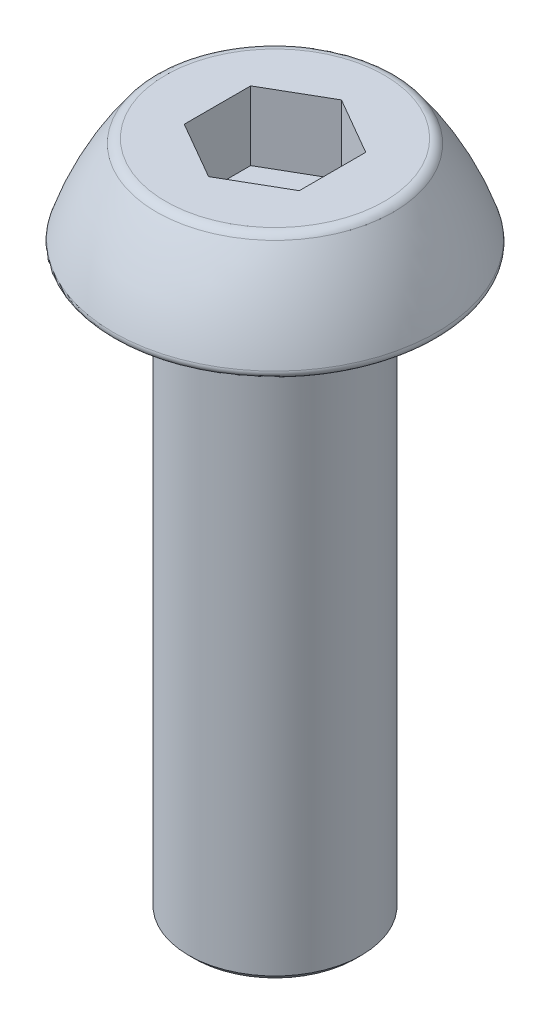
ISO-10303-21;
HEADER;
FILE_DESCRIPTION(('STEP AP214'),'2;1');
FILE_NAME('part.step','',(''),(''),'','','');
FILE_SCHEMA(('AUTOMOTIVE_DESIGN { 1 0 10303 214 1 1 1 1 }'));
ENDSEC;
DATA;
#1=APPLICATION_CONTEXT('core data for automotive mechanical design processes');
#2=APPLICATION_PROTOCOL_DEFINITION('international standard','automotive_design',2000,#1);
#3=PRODUCT_CONTEXT('',#1,'mechanical');
#4=PRODUCT('Part','Part','',(#3));
#5=PRODUCT_RELATED_PRODUCT_CATEGORY('part','',(#4));
#6=PRODUCT_DEFINITION_FORMATION('','',#4);
#7=PRODUCT_DEFINITION_CONTEXT('part definition',#1,'design');
#8=PRODUCT_DEFINITION('design','',#6,#7);
#9=PRODUCT_DEFINITION_SHAPE('','',#8);
#10=(LENGTH_UNIT() NAMED_UNIT(*) SI_UNIT(.MILLI.,.METRE.));
#11=(NAMED_UNIT(*) PLANE_ANGLE_UNIT() SI_UNIT($,.RADIAN.));
#12=(NAMED_UNIT(*) SI_UNIT($,.STERADIAN.) SOLID_ANGLE_UNIT());
#13=UNCERTAINTY_MEASURE_WITH_UNIT(LENGTH_MEASURE(1.E-05),#10,'distance_accuracy_value','');
#14=(GEOMETRIC_REPRESENTATION_CONTEXT(3) GLOBAL_UNCERTAINTY_ASSIGNED_CONTEXT((#13)) GLOBAL_UNIT_ASSIGNED_CONTEXT((#10,
#11,#12)) REPRESENTATION_CONTEXT('',''));
#15=CARTESIAN_POINT('',(0.,0.,0.));
#16=DIRECTION('',(0.,0.,1.));
#17=DIRECTION('',(1.,0.,0.));
#18=AXIS2_PLACEMENT_3D('',#15,#16,#17);
#19=CARTESIAN_POINT('',(0.,0.,0.));
#20=DIRECTION('',(0.,1.,0.));
#21=DIRECTION('',(0.,0.,1.));
#22=AXIS2_PLACEMENT_3D('',#19,#20,#21);
#23=PLANE('',#22);
#24=CARTESIAN_POINT('',(0.,0.,0.));
#25=DIRECTION('',(0.,1.,0.));
#26=DIRECTION('',(0.,0.,1.));
#27=AXIS2_PLACEMENT_3D('',#24,#25,#26);
#28=CIRCLE('',#27,2.71401101775283);
#29=CARTESIAN_POINT('',(0.,0.,2.71401101775283));
#30=VERTEX_POINT('',#29);
#31=EDGE_CURVE('E118',#30,#30,#28,.F.);
#32=ORIENTED_EDGE('',*,*,#31,.T.);
#33=EDGE_LOOP('',(#32));
#34=FACE_BOUND('',#33,.T.);
#35=CARTESIAN_POINT('',(0.,0.,0.));
#36=DIRECTION('',(0.,1.,0.));
#37=DIRECTION('',(0.,0.,1.));
#38=AXIS2_PLACEMENT_3D('',#35,#36,#37);
#39=CIRCLE('',#38,1.5);
#40=CARTESIAN_POINT('',(0.,0.,1.5));
#41=VERTEX_POINT('',#40);
#42=EDGE_CURVE('E137',#41,#41,#39,.F.);
#43=ORIENTED_EDGE('',*,*,#42,.F.);
#44=EDGE_LOOP('',(#43));
#45=FACE_BOUND('',#44,.T.);
#46=ADVANCED_FACE('F17',(#34,#45),#23,.F.);
#47=CARTESIAN_POINT('',(-2.,1.65,0.));
#48=DIRECTION('',(0.,-1.,0.));
#49=DIRECTION('',(0.,0.,-1.));
#50=AXIS2_PLACEMENT_3D('',#47,#48,#49);
#51=PLANE('',#50);
#52=DIRECTION('',(-0.866025403784439,0.,0.5));
#53=VECTOR('',#52,1.);
#54=CARTESIAN_POINT('',(0.,1.65,-1.15470053837925));
#55=LINE('',#54,#53);
#56=CARTESIAN_POINT('',(0.,1.65,-1.15470053837925));
#57=VERTEX_POINT('',#56);
#58=CARTESIAN_POINT('',(-1.,1.65,-0.577350269189626));
#59=VERTEX_POINT('',#58);
#60=EDGE_CURVE('E106',#57,#59,#55,.T.);
#61=ORIENTED_EDGE('',*,*,#60,.F.);
#62=DIRECTION('',(-0.866025403784439,0.,-0.5));
#63=VECTOR('',#62,1.);
#64=CARTESIAN_POINT('',(1.,1.65,-0.577350269189626));
#65=LINE('',#64,#63);
#66=CARTESIAN_POINT('',(1.,1.65,-0.577350269189626));
#67=VERTEX_POINT('',#66);
#68=EDGE_CURVE('E32',#67,#57,#65,.T.);
#69=ORIENTED_EDGE('',*,*,#68,.F.);
#70=DIRECTION('',(0.,0.,-1.));
#71=VECTOR('',#70,1.);
#72=CARTESIAN_POINT('',(1.,1.65,0.577350269189626));
#73=LINE('',#72,#71);
#74=CARTESIAN_POINT('',(1.,1.65,0.577350269189626));
#75=VERTEX_POINT('',#74);
#76=EDGE_CURVE('E113',#75,#67,#73,.T.);
#77=ORIENTED_EDGE('',*,*,#76,.F.);
#78=DIRECTION('',(0.866025403784439,0.,-0.5));
#79=VECTOR('',#78,1.);
#80=CARTESIAN_POINT('',(0.,1.65,1.15470053837925));
#81=LINE('',#80,#79);
#82=CARTESIAN_POINT('',(0.,1.65,1.15470053837925));
#83=VERTEX_POINT('',#82);
#84=EDGE_CURVE('E114',#83,#75,#81,.T.);
#85=ORIENTED_EDGE('',*,*,#84,.F.);
#86=DIRECTION('',(0.866025403784439,0.,0.5));
#87=VECTOR('',#86,1.);
#88=CARTESIAN_POINT('',(-1.,1.65,0.577350269189626));
#89=LINE('',#88,#87);
#90=CARTESIAN_POINT('',(-1.,1.65,0.577350269189626));
#91=VERTEX_POINT('',#90);
#92=EDGE_CURVE('E79',#91,#83,#89,.T.);
#93=ORIENTED_EDGE('',*,*,#92,.F.);
#94=DIRECTION('',(0.,0.,1.));
#95=VECTOR('',#94,1.);
#96=CARTESIAN_POINT('',(-1.,1.65,-0.577350269189626));
#97=LINE('',#96,#95);
#98=EDGE_CURVE('E108',#59,#91,#97,.T.);
#99=ORIENTED_EDGE('',*,*,#98,.F.);
#100=EDGE_LOOP('',(#61,#69,#77,#85,#93,#99));
#101=FACE_BOUND('',#100,.T.);
#102=CARTESIAN_POINT('',(0.,1.65,0.));
#103=DIRECTION('',(0.,-1.,0.));
#104=DIRECTION('',(0.,0.,-1.));
#105=AXIS2_PLACEMENT_3D('',#102,#103,#104);
#106=CIRCLE('',#105,1.90110924353599);
#107=CARTESIAN_POINT('',(0.,1.65,-1.90110924353599));
#108=VERTEX_POINT('',#107);
#109=EDGE_CURVE('E132',#108,#108,#106,.F.);
#110=ORIENTED_EDGE('',*,*,#109,.T.);
#111=EDGE_LOOP('',(#110));
#112=FACE_BOUND('',#111,.T.);
#113=ADVANCED_FACE('F152',(#101,#112),#51,.F.);
#114=CARTESIAN_POINT('',(0.,-1.42499576680782,0.));
#115=DIRECTION('',(0.,-1.,0.));
#116=DIRECTION('',(0.,0.,-1.));
#117=AXIS2_PLACEMENT_3D('',#114,#115,#116);
#118=DEGENERATE_TOROIDAL_SURFACE('',#117,1.94263884145048,5.,.F.);
#119=CARTESIAN_POINT('',(0.,1.56979149028366,0.));
#120=DIRECTION('',(0.,-1.,0.));
#121=DIRECTION('',(0.,0.,-1.));
#122=AXIS2_PLACEMENT_3D('',#119,#120,#121);
#123=CIRCLE('',#122,2.06126541374375);
#124=CARTESIAN_POINT('',(0.,1.56979149028366,-2.06126541374375));
#125=VERTEX_POINT('',#124);
#126=EDGE_CURVE('E129',#125,#125,#123,.T.);
#127=ORIENTED_EDGE('',*,*,#126,.T.);
#128=EDGE_LOOP('',(#127));
#129=FACE_BOUND('',#128,.T.);
#130=CARTESIAN_POINT('',(0.,0.131122362587915,0.));
#131=DIRECTION('',(0.,-1.,0.));
#132=DIRECTION('',(0.,0.,-1.));
#133=AXIS2_PLACEMENT_3D('',#130,#131,#132);
#134=CIRCLE('',#133,2.80904468834882);
#135=CARTESIAN_POINT('',(0.,0.131122362587915,-2.80904468834882));
#136=VERTEX_POINT('',#135);
#137=EDGE_CURVE('E126',#136,#136,#134,.F.);
#138=ORIENTED_EDGE('',*,*,#137,.T.);
#139=EDGE_LOOP('',(#138));
#140=FACE_BOUND('',#139,.T.);
#141=ADVANCED_FACE('F161',(#129,#140),#118,.F.);
#142=CARTESIAN_POINT('',(0.,0.1,0.));
#143=DIRECTION('',(0.,1.,0.));
#144=DIRECTION('',(0.,0.,1.));
#145=AXIS2_PLACEMENT_3D('',#142,#143,#144);
#146=TOROIDAL_SURFACE('',#145,2.71401101775283,0.1);
#147=ORIENTED_EDGE('',*,*,#137,.F.);
#148=EDGE_LOOP('',(#147));
#149=FACE_BOUND('',#148,.T.);
#150=ORIENTED_EDGE('',*,*,#31,.F.);
#151=EDGE_LOOP('',(#150));
#152=FACE_BOUND('',#151,.T.);
#153=ADVANCED_FACE('F168',(#149,#152),#146,.T.);
#154=CARTESIAN_POINT('',(0.,1.45,0.));
#155=DIRECTION('',(0.,-1.,0.));
#156=DIRECTION('',(0.,0.,-1.));
#157=AXIS2_PLACEMENT_3D('',#154,#155,#156);
#158=TOROIDAL_SURFACE('',#157,1.90110924353599,0.2);
#159=ORIENTED_EDGE('',*,*,#109,.F.);
#160=EDGE_LOOP('',(#159));
#161=FACE_BOUND('',#160,.T.);
#162=ORIENTED_EDGE('',*,*,#126,.F.);
#163=EDGE_LOOP('',(#162));
#164=FACE_BOUND('',#163,.T.);
#165=ADVANCED_FACE('F173',(#161,#164),#158,.T.);
#166=CARTESIAN_POINT('',(1.,0.45,-0.577350269189626));
#167=DIRECTION('',(0.5,0.,-0.866025403784439));
#168=DIRECTION('',(-0.866025403784439,0.,-0.5));
#169=AXIS2_PLACEMENT_3D('',#166,#167,#168);
#170=PLANE('',#169);
#171=ORIENTED_EDGE('',*,*,#68,.T.);
#172=DIRECTION('',(0.,1.,0.));
#173=VECTOR('',#172,1.);
#174=CARTESIAN_POINT('',(0.,0.45,-1.15470053837925));
#175=LINE('',#174,#173);
#176=CARTESIAN_POINT('',(0.,0.45,-1.15470053837925));
#177=VERTEX_POINT('',#176);
#178=EDGE_CURVE('E62',#177,#57,#175,.T.);
#179=ORIENTED_EDGE('',*,*,#178,.F.);
#180=DIRECTION('',(-0.866025403784439,0.,-0.5));
#181=VECTOR('',#180,1.);
#182=CARTESIAN_POINT('',(1.,0.45,-0.577350269189626));
#183=LINE('',#182,#181);
#184=CARTESIAN_POINT('',(1.,0.45,-0.577350269189626));
#185=VERTEX_POINT('',#184);
#186=EDGE_CURVE('E117',#185,#177,#183,.T.);
#187=ORIENTED_EDGE('',*,*,#186,.F.);
#188=DIRECTION('',(0.,1.,0.));
#189=VECTOR('',#188,1.);
#190=CARTESIAN_POINT('',(1.,0.45,-0.577350269189626));
#191=LINE('',#190,#189);
#192=EDGE_CURVE('E37',#185,#67,#191,.T.);
#193=ORIENTED_EDGE('',*,*,#192,.T.);
#194=EDGE_LOOP('',(#171,#179,#187,#193));
#195=FACE_BOUND('',#194,.T.);
#196=ADVANCED_FACE('F170',(#195),#170,.F.);
#197=CARTESIAN_POINT('',(1.,0.45,0.577350269189626));
#198=DIRECTION('',(1.,0.,0.));
#199=DIRECTION('',(0.,0.,-1.));
#200=AXIS2_PLACEMENT_3D('',#197,#198,#199);
#201=PLANE('',#200);
#202=ORIENTED_EDGE('',*,*,#76,.T.);
#203=ORIENTED_EDGE('',*,*,#192,.F.);
#204=DIRECTION('',(0.,0.,-1.));
#205=VECTOR('',#204,1.);
#206=CARTESIAN_POINT('',(1.,0.45,0.577350269189626));
#207=LINE('',#206,#205);
#208=CARTESIAN_POINT('',(1.,0.45,0.577350269189626));
#209=VERTEX_POINT('',#208);
#210=EDGE_CURVE('E95',#209,#185,#207,.T.);
#211=ORIENTED_EDGE('',*,*,#210,.F.);
#212=DIRECTION('',(0.,1.,0.));
#213=VECTOR('',#212,1.);
#214=CARTESIAN_POINT('',(1.,0.45,0.577350269189626));
#215=LINE('',#214,#213);
#216=EDGE_CURVE('E81',#209,#75,#215,.T.);
#217=ORIENTED_EDGE('',*,*,#216,.T.);
#218=EDGE_LOOP('',(#202,#203,#211,#217));
#219=FACE_BOUND('',#218,.T.);
#220=ADVANCED_FACE('F181',(#219),#201,.F.);
#221=CARTESIAN_POINT('',(0.,0.45,1.15470053837925));
#222=DIRECTION('',(0.5,0.,0.866025403784439));
#223=DIRECTION('',(0.866025403784439,0.,-0.5));
#224=AXIS2_PLACEMENT_3D('',#221,#222,#223);
#225=PLANE('',#224);
#226=ORIENTED_EDGE('',*,*,#84,.T.);
#227=ORIENTED_EDGE('',*,*,#216,.F.);
#228=DIRECTION('',(0.866025403784439,0.,-0.5));
#229=VECTOR('',#228,1.);
#230=CARTESIAN_POINT('',(0.,0.45,1.15470053837925));
#231=LINE('',#230,#229);
#232=CARTESIAN_POINT('',(0.,0.45,1.15470053837925));
#233=VERTEX_POINT('',#232);
#234=EDGE_CURVE('E86',#233,#209,#231,.T.);
#235=ORIENTED_EDGE('',*,*,#234,.F.);
#236=DIRECTION('',(0.,1.,0.));
#237=VECTOR('',#236,1.);
#238=CARTESIAN_POINT('',(0.,0.45,1.15470053837925));
#239=LINE('',#238,#237);
#240=EDGE_CURVE('E73',#233,#83,#239,.T.);
#241=ORIENTED_EDGE('',*,*,#240,.T.);
#242=EDGE_LOOP('',(#226,#227,#235,#241));
#243=FACE_BOUND('',#242,.T.);
#244=ADVANCED_FACE('F90',(#243),#225,.F.);
#245=CARTESIAN_POINT('',(-1.,0.45,0.577350269189626));
#246=DIRECTION('',(-0.5,0.,0.866025403784439));
#247=DIRECTION('',(0.866025403784439,0.,0.5));
#248=AXIS2_PLACEMENT_3D('',#245,#246,#247);
#249=PLANE('',#248);
#250=ORIENTED_EDGE('',*,*,#92,.T.);
#251=ORIENTED_EDGE('',*,*,#240,.F.);
#252=DIRECTION('',(0.866025403784439,0.,0.5));
#253=VECTOR('',#252,1.);
#254=CARTESIAN_POINT('',(-1.,0.45,0.577350269189626));
#255=LINE('',#254,#253);
#256=CARTESIAN_POINT('',(-1.,0.45,0.577350269189626));
#257=VERTEX_POINT('',#256);
#258=EDGE_CURVE('E80',#257,#233,#255,.T.);
#259=ORIENTED_EDGE('',*,*,#258,.F.);
#260=DIRECTION('',(0.,1.,0.));
#261=VECTOR('',#260,1.);
#262=CARTESIAN_POINT('',(-1.,0.45,0.577350269189626));
#263=LINE('',#262,#261);
#264=EDGE_CURVE('E83',#257,#91,#263,.T.);
#265=ORIENTED_EDGE('',*,*,#264,.T.);
#266=EDGE_LOOP('',(#250,#251,#259,#265));
#267=FACE_BOUND('',#266,.T.);
#268=ADVANCED_FACE('F74',(#267),#249,.F.);
#269=CARTESIAN_POINT('',(-1.,0.45,-0.577350269189626));
#270=DIRECTION('',(-1.,0.,0.));
#271=DIRECTION('',(0.,0.,1.));
#272=AXIS2_PLACEMENT_3D('',#269,#270,#271);
#273=PLANE('',#272);
#274=ORIENTED_EDGE('',*,*,#98,.T.);
#275=ORIENTED_EDGE('',*,*,#264,.F.);
#276=DIRECTION('',(0.,0.,1.));
#277=VECTOR('',#276,1.);
#278=CARTESIAN_POINT('',(-1.,0.45,-0.577350269189626));
#279=LINE('',#278,#277);
#280=CARTESIAN_POINT('',(-1.,0.45,-0.577350269189626));
#281=VERTEX_POINT('',#280);
#282=EDGE_CURVE('E98',#281,#257,#279,.T.);
#283=ORIENTED_EDGE('',*,*,#282,.F.);
#284=DIRECTION('',(0.,1.,0.));
#285=VECTOR('',#284,1.);
#286=CARTESIAN_POINT('',(-1.,0.45,-0.577350269189626));
#287=LINE('',#286,#285);
#288=EDGE_CURVE('E121',#281,#59,#287,.T.);
#289=ORIENTED_EDGE('',*,*,#288,.T.);
#290=EDGE_LOOP('',(#274,#275,#283,#289));
#291=FACE_BOUND('',#290,.T.);
#292=ADVANCED_FACE('F206',(#291),#273,.F.);
#293=CARTESIAN_POINT('',(0.,0.45,-1.15470053837925));
#294=DIRECTION('',(-0.5,0.,-0.866025403784439));
#295=DIRECTION('',(-0.866025403784439,0.,0.5));
#296=AXIS2_PLACEMENT_3D('',#293,#294,#295);
#297=PLANE('',#296);
#298=ORIENTED_EDGE('',*,*,#60,.T.);
#299=ORIENTED_EDGE('',*,*,#288,.F.);
#300=DIRECTION('',(-0.866025403784439,0.,0.5));
#301=VECTOR('',#300,1.);
#302=CARTESIAN_POINT('',(0.,0.45,-1.15470053837925));
#303=LINE('',#302,#301);
#304=EDGE_CURVE('E99',#177,#281,#303,.T.);
#305=ORIENTED_EDGE('',*,*,#304,.F.);
#306=ORIENTED_EDGE('',*,*,#178,.T.);
#307=EDGE_LOOP('',(#298,#299,#305,#306));
#308=FACE_BOUND('',#307,.T.);
#309=ADVANCED_FACE('F208',(#308),#297,.F.);
#310=CARTESIAN_POINT('',(0.,0.45,0.));
#311=DIRECTION('',(0.,1.,0.));
#312=DIRECTION('',(0.,0.,1.));
#313=AXIS2_PLACEMENT_3D('',#310,#311,#312);
#314=PLANE('',#313);
#315=ORIENTED_EDGE('',*,*,#186,.T.);
#316=ORIENTED_EDGE('',*,*,#304,.T.);
#317=ORIENTED_EDGE('',*,*,#282,.T.);
#318=ORIENTED_EDGE('',*,*,#258,.T.);
#319=ORIENTED_EDGE('',*,*,#234,.T.);
#320=ORIENTED_EDGE('',*,*,#210,.T.);
#321=EDGE_LOOP('',(#315,#316,#317,#318,#319,#320));
#322=FACE_BOUND('',#321,.T.);
#323=ADVANCED_FACE('F92',(#322),#314,.T.);
#324=CARTESIAN_POINT('',(0.,-10.,0.));
#325=DIRECTION('',(0.,1.,0.));
#326=DIRECTION('',(0.,0.,1.));
#327=AXIS2_PLACEMENT_3D('',#324,#325,#326);
#328=CYLINDRICAL_SURFACE('',#327,1.5);
#329=CARTESIAN_POINT('',(0.,-9.9,0.));
#330=DIRECTION('',(0.,-1.,0.));
#331=DIRECTION('',(0.,0.,-1.));
#332=AXIS2_PLACEMENT_3D('',#329,#330,#331);
#333=CIRCLE('',#332,1.5);
#334=CARTESIAN_POINT('',(0.,-9.9,-1.5));
#335=VERTEX_POINT('',#334);
#336=EDGE_CURVE('E11',#335,#335,#333,.F.);
#337=ORIENTED_EDGE('',*,*,#336,.T.);
#338=EDGE_LOOP('',(#337));
#339=FACE_BOUND('',#338,.T.);
#340=ORIENTED_EDGE('',*,*,#42,.T.);
#341=EDGE_LOOP('',(#340));
#342=FACE_BOUND('',#341,.T.);
#343=ADVANCED_FACE('F147',(#339,#342),#328,.T.);
#344=CARTESIAN_POINT('',(0.,-10.,0.));
#345=DIRECTION('',(0.,-1.,0.));
#346=DIRECTION('',(0.,0.,-1.));
#347=AXIS2_PLACEMENT_3D('',#344,#345,#346);
#348=PLANE('',#347);
#349=CARTESIAN_POINT('',(0.,-10.,0.));
#350=DIRECTION('',(0.,-1.,0.));
#351=DIRECTION('',(0.,0.,-1.));
#352=AXIS2_PLACEMENT_3D('',#349,#350,#351);
#353=CIRCLE('',#352,1.4);
#354=CARTESIAN_POINT('',(0.,-10.,-1.4));
#355=VERTEX_POINT('',#354);
#356=EDGE_CURVE('E25',#355,#355,#353,.T.);
#357=ORIENTED_EDGE('',*,*,#356,.T.);
#358=EDGE_LOOP('',(#357));
#359=FACE_BOUND('',#358,.T.);
#360=ADVANCED_FACE('F143',(#359),#348,.T.);
#361=CARTESIAN_POINT('',(0.,-10.,0.));
#362=DIRECTION('',(0.,1.,0.));
#363=DIRECTION('',(0.,0.,1.));
#364=AXIS2_PLACEMENT_3D('',#361,#362,#363);
#365=CONICAL_SURFACE('',#364,1.4,0.785398163397444);
#366=ORIENTED_EDGE('',*,*,#336,.F.);
#367=EDGE_LOOP('',(#366));
#368=FACE_BOUND('',#367,.T.);
#369=ORIENTED_EDGE('',*,*,#356,.F.);
#370=EDGE_LOOP('',(#369));
#371=FACE_BOUND('',#370,.T.);
#372=ADVANCED_FACE('F19',(#368,#371),#365,.T.);
#373=CLOSED_SHELL('',(#46,#113,#141,#153,#165,#196,#220,#244,#268,#292,#309,#323,#343,#360,#372));
#374=MANIFOLD_SOLID_BREP('B1',#373);
#375=ADVANCED_BREP_SHAPE_REPRESENTATION('',(#18,#374),#14);
#376=SHAPE_DEFINITION_REPRESENTATION(#9,#375);
ENDSEC;
END-ISO-10303-21;
